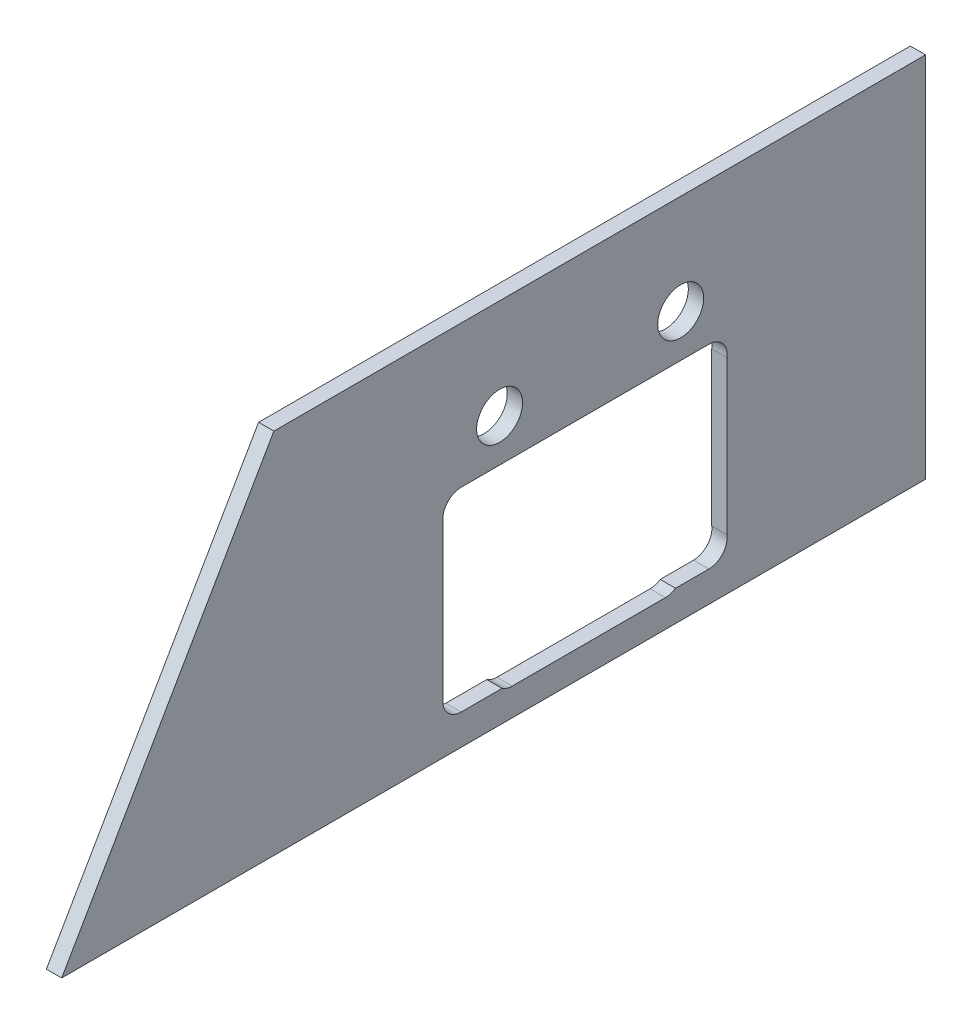
ISO-10303-21;
HEADER;
FILE_DESCRIPTION(('STEP AP214'),'2;1');
FILE_NAME('part.step','',(''),(''),'','','');
FILE_SCHEMA(('AUTOMOTIVE_DESIGN { 1 0 10303 214 1 1 1 1 }'));
ENDSEC;
DATA;
#1=APPLICATION_CONTEXT('core data for automotive mechanical design processes');
#2=APPLICATION_PROTOCOL_DEFINITION('international standard','automotive_design',2000,#1);
#3=PRODUCT_CONTEXT('',#1,'mechanical');
#4=PRODUCT('Part','Part','',(#3));
#5=PRODUCT_RELATED_PRODUCT_CATEGORY('part','',(#4));
#6=PRODUCT_DEFINITION_FORMATION('','',#4);
#7=PRODUCT_DEFINITION_CONTEXT('part definition',#1,'design');
#8=PRODUCT_DEFINITION('design','',#6,#7);
#9=PRODUCT_DEFINITION_SHAPE('','',#8);
#10=(LENGTH_UNIT() NAMED_UNIT(*) SI_UNIT(.MILLI.,.METRE.));
#11=(NAMED_UNIT(*) PLANE_ANGLE_UNIT() SI_UNIT($,.RADIAN.));
#12=(NAMED_UNIT(*) SI_UNIT($,.STERADIAN.) SOLID_ANGLE_UNIT());
#13=UNCERTAINTY_MEASURE_WITH_UNIT(LENGTH_MEASURE(1.E-05),#10,'distance_accuracy_value','');
#14=(GEOMETRIC_REPRESENTATION_CONTEXT(3) GLOBAL_UNCERTAINTY_ASSIGNED_CONTEXT((#13)) GLOBAL_UNIT_ASSIGNED_CONTEXT((#10,
#11,#12)) REPRESENTATION_CONTEXT('',''));
#15=CARTESIAN_POINT('',(0.,0.,0.));
#16=DIRECTION('',(0.,0.,1.));
#17=DIRECTION('',(1.,0.,0.));
#18=AXIS2_PLACEMENT_3D('',#15,#16,#17);
#19=CARTESIAN_POINT('',(1.,-19.5,-28.2163391035964));
#20=DIRECTION('',(0.,1.,0.));
#21=DIRECTION('',(0.,0.,1.));
#22=AXIS2_PLACEMENT_3D('',#19,#20,#21);
#23=PLANE('',#22);
#24=DIRECTION('',(0.,0.,-1.));
#25=VECTOR('',#24,1.);
#26=CARTESIAN_POINT('',(0.,-19.5,-28.2163391035964));
#27=LINE('',#26,#25);
#28=CARTESIAN_POINT('',(0.,-19.5,28.2163391035964));
#29=VERTEX_POINT('',#28);
#30=CARTESIAN_POINT('',(0.,-19.5,-28.2163391035964));
#31=VERTEX_POINT('',#30);
#32=EDGE_CURVE('E261',#29,#31,#27,.T.);
#33=ORIENTED_EDGE('',*,*,#32,.T.);
#34=DIRECTION('',(-1.,0.,0.));
#35=VECTOR('',#34,1.);
#36=CARTESIAN_POINT('',(1.,-19.5,-28.2163391035964));
#37=LINE('',#36,#35);
#38=CARTESIAN_POINT('',(1.,-19.5,-28.2163391035964));
#39=VERTEX_POINT('',#38);
#40=EDGE_CURVE('E50',#39,#31,#37,.T.);
#41=ORIENTED_EDGE('',*,*,#40,.F.);
#42=DIRECTION('',(0.,0.,-1.));
#43=VECTOR('',#42,1.);
#44=CARTESIAN_POINT('',(1.,-19.5,-28.2163391035964));
#45=LINE('',#44,#43);
#46=CARTESIAN_POINT('',(1.,-19.5,28.2163391035964));
#47=VERTEX_POINT('',#46);
#48=EDGE_CURVE('E264',#47,#39,#45,.T.);
#49=ORIENTED_EDGE('',*,*,#48,.F.);
#50=DIRECTION('',(-1.,0.,0.));
#51=VECTOR('',#50,1.);
#52=CARTESIAN_POINT('',(1.,-19.5,28.2163391035964));
#53=LINE('',#52,#51);
#54=EDGE_CURVE('E270',#47,#29,#53,.T.);
#55=ORIENTED_EDGE('',*,*,#54,.T.);
#56=EDGE_LOOP('',(#33,#41,#49,#55));
#57=FACE_BOUND('',#56,.T.);
#58=ADVANCED_FACE('F43',(#57),#23,.F.);
#59=CARTESIAN_POINT('',(1.,4.50718127274804,-28.2163391035964));
#60=DIRECTION('',(0.,0.,1.));
#61=DIRECTION('',(1.,0.,0.));
#62=AXIS2_PLACEMENT_3D('',#59,#60,#61);
#63=PLANE('',#62);
#64=DIRECTION('',(0.,1.,0.));
#65=VECTOR('',#64,1.);
#66=CARTESIAN_POINT('',(0.,4.50718127274804,-28.2163391035964));
#67=LINE('',#66,#65);
#68=CARTESIAN_POINT('',(0.,4.50718127274804,-28.2163391035964));
#69=VERTEX_POINT('',#68);
#70=EDGE_CURVE('E273',#31,#69,#67,.T.);
#71=ORIENTED_EDGE('',*,*,#70,.T.);
#72=DIRECTION('',(-1.,0.,0.));
#73=VECTOR('',#72,1.);
#74=CARTESIAN_POINT('',(1.,4.50718127274804,-28.2163391035964));
#75=LINE('',#74,#73);
#76=CARTESIAN_POINT('',(1.,4.50718127274804,-28.2163391035964));
#77=VERTEX_POINT('',#76);
#78=EDGE_CURVE('E281',#77,#69,#75,.T.);
#79=ORIENTED_EDGE('',*,*,#78,.F.);
#80=DIRECTION('',(0.,1.,0.));
#81=VECTOR('',#80,1.);
#82=CARTESIAN_POINT('',(1.,4.50718127274804,-28.2163391035964));
#83=LINE('',#82,#81);
#84=EDGE_CURVE('E94',#39,#77,#83,.T.);
#85=ORIENTED_EDGE('',*,*,#84,.F.);
#86=ORIENTED_EDGE('',*,*,#40,.T.);
#87=EDGE_LOOP('',(#71,#79,#85,#86));
#88=FACE_BOUND('',#87,.T.);
#89=ADVANCED_FACE('F284',(#88),#63,.F.);
#90=CARTESIAN_POINT('',(1.,4.50718127274804,14.3557865332913));
#91=DIRECTION('',(0.,-1.,0.));
#92=DIRECTION('',(0.,0.,-1.));
#93=AXIS2_PLACEMENT_3D('',#90,#91,#92);
#94=PLANE('',#93);
#95=DIRECTION('',(0.,0.,1.));
#96=VECTOR('',#95,1.);
#97=CARTESIAN_POINT('',(0.,4.50718127274804,14.3557865332913));
#98=LINE('',#97,#96);
#99=CARTESIAN_POINT('',(0.,4.50718127274804,14.3557865332913));
#100=VERTEX_POINT('',#99);
#101=EDGE_CURVE('E275',#69,#100,#98,.T.);
#102=ORIENTED_EDGE('',*,*,#101,.T.);
#103=DIRECTION('',(-1.,0.,0.));
#104=VECTOR('',#103,1.);
#105=CARTESIAN_POINT('',(1.,4.50718127274804,14.3557865332913));
#106=LINE('',#105,#104);
#107=CARTESIAN_POINT('',(1.,4.50718127274804,14.3557865332913));
#108=VERTEX_POINT('',#107);
#109=EDGE_CURVE('E279',#108,#100,#106,.T.);
#110=ORIENTED_EDGE('',*,*,#109,.F.);
#111=DIRECTION('',(0.,0.,1.));
#112=VECTOR('',#111,1.);
#113=CARTESIAN_POINT('',(1.,4.50718127274804,14.3557865332913));
#114=LINE('',#113,#112);
#115=EDGE_CURVE('E267',#77,#108,#114,.T.);
#116=ORIENTED_EDGE('',*,*,#115,.F.);
#117=ORIENTED_EDGE('',*,*,#78,.T.);
#118=EDGE_LOOP('',(#102,#110,#116,#117));
#119=FACE_BOUND('',#118,.T.);
#120=ADVANCED_FACE('F293',(#119),#94,.F.);
#121=CARTESIAN_POINT('',(1.,-19.5,28.2163391035964));
#122=DIRECTION('',(0.,-0.499999999999997,-0.86602540378444));
#123=DIRECTION('',(0.,0.86602540378444,-0.499999999999997));
#124=AXIS2_PLACEMENT_3D('',#121,#122,#123);
#125=PLANE('',#124);
#126=DIRECTION('',(0.,-0.86602540378444,0.499999999999997));
#127=VECTOR('',#126,1.);
#128=CARTESIAN_POINT('',(0.,-19.5,28.2163391035964));
#129=LINE('',#128,#127);
#130=EDGE_CURVE('E86',#100,#29,#129,.T.);
#131=ORIENTED_EDGE('',*,*,#130,.T.);
#132=ORIENTED_EDGE('',*,*,#54,.F.);
#133=DIRECTION('',(0.,-0.86602540378444,0.499999999999997));
#134=VECTOR('',#133,1.);
#135=CARTESIAN_POINT('',(1.,-19.5,28.2163391035964));
#136=LINE('',#135,#134);
#137=EDGE_CURVE('E65',#108,#47,#136,.T.);
#138=ORIENTED_EDGE('',*,*,#137,.F.);
#139=ORIENTED_EDGE('',*,*,#109,.T.);
#140=EDGE_LOOP('',(#131,#132,#138,#139));
#141=FACE_BOUND('',#140,.T.);
#142=ADVANCED_FACE('F295',(#141),#125,.F.);
#143=CARTESIAN_POINT('',(1.,0.,0.));
#144=DIRECTION('',(1.,0.,0.));
#145=DIRECTION('',(0.,0.,-1.));
#146=AXIS2_PLACEMENT_3D('',#143,#144,#145);
#147=PLANE('',#146);
#148=DIRECTION('',(0.,0.,-1.));
#149=VECTOR('',#148,1.);
#150=CARTESIAN_POINT('',(1.,-17.5000000000001,2.12539432331838));
#151=LINE('',#150,#149);
#152=CARTESIAN_POINT('',(1.,-17.5,-11.8796640616671));
#153=VERTEX_POINT('',#152);
#154=CARTESIAN_POINT('',(1.,-17.5,-14.0583018670131));
#155=VERTEX_POINT('',#154);
#156=EDGE_CURVE('E204',#153,#155,#151,.T.);
#157=ORIENTED_EDGE('',*,*,#156,.F.);
#158=CARTESIAN_POINT('',(1.,-16.5,-11.216339103596));
#159=DIRECTION('',(-1.,0.,0.));
#160=DIRECTION('',(0.,0.,1.));
#161=AXIS2_PLACEMENT_3D('',#158,#159,#160);
#162=CIRCLE('',#161,1.2);
#163=CARTESIAN_POINT('',(1.,-17.7,-11.216339103596));
#164=VERTEX_POINT('',#163);
#165=EDGE_CURVE('E243',#153,#164,#162,.T.);
#166=ORIENTED_EDGE('',*,*,#165,.T.);
#167=DIRECTION('',(0.,0.,1.));
#168=VECTOR('',#167,1.);
#169=CARTESIAN_POINT('',(1.,-17.7,-1.21633910359602));
#170=LINE('',#169,#168);
#171=CARTESIAN_POINT('',(1.,-17.7,-1.21633910359602));
#172=VERTEX_POINT('',#171);
#173=EDGE_CURVE('E245',#164,#172,#170,.T.);
#174=ORIENTED_EDGE('',*,*,#173,.T.);
#175=CARTESIAN_POINT('',(1.,-16.5,-1.21633910359602));
#176=DIRECTION('',(-1.,0.,0.));
#177=DIRECTION('',(0.,0.,1.));
#178=AXIS2_PLACEMENT_3D('',#175,#176,#177);
#179=CIRCLE('',#178,1.2);
#180=CARTESIAN_POINT('',(1.,-17.5000000000001,-0.553014145525082));
#181=VERTEX_POINT('',#180);
#182=EDGE_CURVE('E249',#172,#181,#179,.T.);
#183=ORIENTED_EDGE('',*,*,#182,.T.);
#184=CARTESIAN_POINT('',(1.,-17.5000000000001,2.12539432331838));
#185=VERTEX_POINT('',#184);
#186=EDGE_CURVE('E205',#185,#181,#151,.T.);
#187=ORIENTED_EDGE('',*,*,#186,.F.);
#188=CARTESIAN_POINT('',(1.,-16.3000195145083,2.11855075413858));
#189=DIRECTION('',(1.,0.,0.));
#190=DIRECTION('',(0.,0.,-1.));
#191=AXIS2_PLACEMENT_3D('',#188,#189,#190);
#192=CIRCLE('',#191,1.20000000000012);
#193=CARTESIAN_POINT('',(1.,-16.1542229816529,3.30966089640405));
#194=VERTEX_POINT('',#193);
#195=EDGE_CURVE('E201',#194,#185,#192,.T.);
#196=ORIENTED_EDGE('',*,*,#195,.F.);
#197=DIRECTION('',(0.,-1.,0.));
#198=VECTOR('',#197,1.);
#199=CARTESIAN_POINT('',(1.,-6.12891273012506,3.30966089640403));
#200=LINE('',#199,#198);
#201=CARTESIAN_POINT('',(1.,-6.12891273012505,3.30966089640402));
#202=VERTEX_POINT('',#201);
#203=EDGE_CURVE('E195',#202,#194,#200,.T.);
#204=ORIENTED_EDGE('',*,*,#203,.F.);
#205=CARTESIAN_POINT('',(1.,-5.9859804854917,2.1182036485583));
#206=DIRECTION('',(1.,0.,0.));
#207=DIRECTION('',(0.,0.,-1.));
#208=AXIS2_PLACEMENT_3D('',#205,#206,#207);
#209=CIRCLE('',#208,1.20000000000001);
#210=CARTESIAN_POINT('',(1.,-4.78599999999996,2.12504721772877));
#211=VERTEX_POINT('',#210);
#212=EDGE_CURVE('E193',#211,#202,#209,.T.);
#213=ORIENTED_EDGE('',*,*,#212,.F.);
#214=DIRECTION('',(0.,0.,1.));
#215=VECTOR('',#214,1.);
#216=CARTESIAN_POINT('',(1.,-4.78599999999996,-14.0586489726027));
#217=LINE('',#216,#215);
#218=CARTESIAN_POINT('',(1.,-4.78599999999996,-14.0586489726027));
#219=VERTEX_POINT('',#218);
#220=EDGE_CURVE('E170',#219,#211,#217,.T.);
#221=ORIENTED_EDGE('',*,*,#220,.F.);
#222=CARTESIAN_POINT('',(1.,-5.98599512140252,-14.0552271879666));
#223=DIRECTION('',(1.,0.,0.));
#224=DIRECTION('',(0.,0.,-1.));
#225=AXIS2_PLACEMENT_3D('',#222,#223,#224);
#226=CIRCLE('',#225,1.19999999999996);
#227=CARTESIAN_POINT('',(1.,-6.13177716572033,-15.246339103596));
#228=VERTEX_POINT('',#227);
#229=EDGE_CURVE('E180',#228,#219,#226,.T.);
#230=ORIENTED_EDGE('',*,*,#229,.F.);
#231=DIRECTION('',(0.,1.,0.));
#232=VECTOR('',#231,1.);
#233=CARTESIAN_POINT('',(1.,-16.157087417248,-15.246339103596));
#234=LINE('',#233,#232);
#235=CARTESIAN_POINT('',(1.,-16.157087417248,-15.246339103596));
#236=VERTEX_POINT('',#235);
#237=EDGE_CURVE('E177',#236,#228,#234,.T.);
#238=ORIENTED_EDGE('',*,*,#237,.F.);
#239=CARTESIAN_POINT('',(1.,-16.3000048785974,-14.0548800823781));
#240=DIRECTION('',(1.,0.,0.));
#241=DIRECTION('',(0.,0.,-1.));
#242=AXIS2_PLACEMENT_3D('',#239,#240,#241);
#243=CIRCLE('',#242,1.20000000000001);
#244=EDGE_CURVE('E207',#155,#236,#243,.T.);
#245=ORIENTED_EDGE('',*,*,#244,.F.);
#246=EDGE_LOOP('',(#157,#166,#174,#183,#187,#196,#204,#213,#221,#230,#238,#245));
#247=FACE_BOUND('',#246,.T.);
#248=CARTESIAN_POINT('',(1.,-2.,-12.216339103596));
#249=DIRECTION('',(-1.,0.,0.));
#250=DIRECTION('',(0.,0.,1.));
#251=AXIS2_PLACEMENT_3D('',#248,#249,#250);
#252=CIRCLE('',#251,1.5);
#253=CARTESIAN_POINT('',(1.,-2.,-10.716339103596));
#254=VERTEX_POINT('',#253);
#255=EDGE_CURVE('E231',#254,#254,#252,.T.);
#256=ORIENTED_EDGE('',*,*,#255,.T.);
#257=EDGE_LOOP('',(#256));
#258=FACE_BOUND('',#257,.T.);
#259=CARTESIAN_POINT('',(1.,-2.,-0.387535442337716));
#260=DIRECTION('',(-1.,0.,0.));
#261=DIRECTION('',(0.,0.,1.));
#262=AXIS2_PLACEMENT_3D('',#259,#260,#261);
#263=CIRCLE('',#262,1.5);
#264=CARTESIAN_POINT('',(1.,-2.,1.11246455766228));
#265=VERTEX_POINT('',#264);
#266=EDGE_CURVE('E238',#265,#265,#263,.T.);
#267=ORIENTED_EDGE('',*,*,#266,.T.);
#268=EDGE_LOOP('',(#267));
#269=FACE_BOUND('',#268,.T.);
#270=ORIENTED_EDGE('',*,*,#48,.T.);
#271=ORIENTED_EDGE('',*,*,#84,.T.);
#272=ORIENTED_EDGE('',*,*,#115,.T.);
#273=ORIENTED_EDGE('',*,*,#137,.T.);
#274=EDGE_LOOP('',(#270,#271,#272,#273));
#275=FACE_BOUND('',#274,.T.);
#276=ADVANCED_FACE('F189',(#247,#258,#269,#275),#147,.T.);
#277=CARTESIAN_POINT('',(0.,0.,0.));
#278=DIRECTION('',(1.,0.,0.));
#279=DIRECTION('',(0.,0.,-1.));
#280=AXIS2_PLACEMENT_3D('',#277,#278,#279);
#281=PLANE('',#280);
#282=CARTESIAN_POINT('',(0.,-16.5,-11.216339103596));
#283=DIRECTION('',(-1.,0.,0.));
#284=DIRECTION('',(0.,0.,1.));
#285=AXIS2_PLACEMENT_3D('',#282,#283,#284);
#286=CIRCLE('',#285,1.2);
#287=CARTESIAN_POINT('',(0.,-17.5,-11.8796640616671));
#288=VERTEX_POINT('',#287);
#289=CARTESIAN_POINT('',(0.,-17.7,-11.216339103596));
#290=VERTEX_POINT('',#289);
#291=EDGE_CURVE('E234',#288,#290,#286,.T.);
#292=ORIENTED_EDGE('',*,*,#291,.F.);
#293=DIRECTION('',(0.,0.,1.));
#294=VECTOR('',#293,1.);
#295=CARTESIAN_POINT('',(0.,-17.5000000000001,2.12539432331838));
#296=LINE('',#295,#294);
#297=CARTESIAN_POINT('',(0.,-17.5,-14.0583018670131));
#298=VERTEX_POINT('',#297);
#299=EDGE_CURVE('E57',#298,#288,#296,.T.);
#300=ORIENTED_EDGE('',*,*,#299,.F.);
#301=CARTESIAN_POINT('',(0.,-16.3000048785974,-14.0548800823781));
#302=DIRECTION('',(1.,0.,0.));
#303=DIRECTION('',(0.,0.,-1.));
#304=AXIS2_PLACEMENT_3D('',#301,#302,#303);
#305=CIRCLE('',#304,1.20000000000001);
#306=CARTESIAN_POINT('',(0.,-16.157087417248,-15.246339103596));
#307=VERTEX_POINT('',#306);
#308=EDGE_CURVE('E481',#307,#298,#305,.F.);
#309=ORIENTED_EDGE('',*,*,#308,.F.);
#310=DIRECTION('',(0.,-1.,0.));
#311=VECTOR('',#310,1.);
#312=CARTESIAN_POINT('',(0.,-16.157087417248,-15.246339103596));
#313=LINE('',#312,#311);
#314=CARTESIAN_POINT('',(0.,-6.13177716572033,-15.246339103596));
#315=VERTEX_POINT('',#314);
#316=EDGE_CURVE('E480',#315,#307,#313,.T.);
#317=ORIENTED_EDGE('',*,*,#316,.F.);
#318=CARTESIAN_POINT('',(0.,-5.98599512140252,-14.0552271879666));
#319=DIRECTION('',(1.,0.,0.));
#320=DIRECTION('',(0.,0.,-1.));
#321=AXIS2_PLACEMENT_3D('',#318,#319,#320);
#322=CIRCLE('',#321,1.19999999999996);
#323=CARTESIAN_POINT('',(0.,-4.78599999999996,-14.0586489726027));
#324=VERTEX_POINT('',#323);
#325=EDGE_CURVE('E227',#324,#315,#322,.F.);
#326=ORIENTED_EDGE('',*,*,#325,.F.);
#327=DIRECTION('',(0.,0.,-1.));
#328=VECTOR('',#327,1.);
#329=CARTESIAN_POINT('',(0.,-4.78599999999996,-14.0586489726027));
#330=LINE('',#329,#328);
#331=CARTESIAN_POINT('',(0.,-4.78599999999996,2.12504721772877));
#332=VERTEX_POINT('',#331);
#333=EDGE_CURVE('E173',#332,#324,#330,.T.);
#334=ORIENTED_EDGE('',*,*,#333,.F.);
#335=CARTESIAN_POINT('',(0.,-5.9859804854917,2.1182036485583));
#336=DIRECTION('',(1.,0.,0.));
#337=DIRECTION('',(0.,0.,-1.));
#338=AXIS2_PLACEMENT_3D('',#335,#336,#337);
#339=CIRCLE('',#338,1.20000000000001);
#340=CARTESIAN_POINT('',(0.,-6.12891273012505,3.30966089640402));
#341=VERTEX_POINT('',#340);
#342=EDGE_CURVE('E212',#341,#332,#339,.F.);
#343=ORIENTED_EDGE('',*,*,#342,.F.);
#344=DIRECTION('',(0.,1.,0.));
#345=VECTOR('',#344,1.);
#346=CARTESIAN_POINT('',(0.,-6.12891273012506,3.30966089640403));
#347=LINE('',#346,#345);
#348=CARTESIAN_POINT('',(0.,-16.1542229816529,3.30966089640405));
#349=VERTEX_POINT('',#348);
#350=EDGE_CURVE('E475',#349,#341,#347,.T.);
#351=ORIENTED_EDGE('',*,*,#350,.F.);
#352=CARTESIAN_POINT('',(0.,-16.3000195145083,2.11855075413858));
#353=DIRECTION('',(1.,0.,0.));
#354=DIRECTION('',(0.,0.,-1.));
#355=AXIS2_PLACEMENT_3D('',#352,#353,#354);
#356=CIRCLE('',#355,1.20000000000012);
#357=CARTESIAN_POINT('',(0.,-17.5000000000001,2.12539432331838));
#358=VERTEX_POINT('',#357);
#359=EDGE_CURVE('E487',#358,#349,#356,.F.);
#360=ORIENTED_EDGE('',*,*,#359,.F.);
#361=CARTESIAN_POINT('',(0.,-17.5000000000001,-0.553014145525082));
#362=VERTEX_POINT('',#361);
#363=EDGE_CURVE('E486',#362,#358,#296,.T.);
#364=ORIENTED_EDGE('',*,*,#363,.F.);
#365=CARTESIAN_POINT('',(0.,-16.5,-1.21633910359602));
#366=DIRECTION('',(-1.,0.,0.));
#367=DIRECTION('',(0.,0.,1.));
#368=AXIS2_PLACEMENT_3D('',#365,#366,#367);
#369=CIRCLE('',#368,1.2);
#370=CARTESIAN_POINT('',(0.,-17.7,-1.21633910359602));
#371=VERTEX_POINT('',#370);
#372=EDGE_CURVE('E246',#371,#362,#369,.T.);
#373=ORIENTED_EDGE('',*,*,#372,.F.);
#374=DIRECTION('',(0.,0.,1.));
#375=VECTOR('',#374,1.);
#376=CARTESIAN_POINT('',(0.,-17.7,-1.21633910359602));
#377=LINE('',#376,#375);
#378=EDGE_CURVE('E254',#290,#371,#377,.T.);
#379=ORIENTED_EDGE('',*,*,#378,.F.);
#380=EDGE_LOOP('',(#292,#300,#309,#317,#326,#334,#343,#351,#360,#364,#373,#379));
#381=FACE_BOUND('',#380,.T.);
#382=CARTESIAN_POINT('',(0.,-2.,-12.216339103596));
#383=DIRECTION('',(-1.,0.,0.));
#384=DIRECTION('',(0.,0.,1.));
#385=AXIS2_PLACEMENT_3D('',#382,#383,#384);
#386=CIRCLE('',#385,1.5);
#387=CARTESIAN_POINT('',(0.,-2.,-10.716339103596));
#388=VERTEX_POINT('',#387);
#389=EDGE_CURVE('E235',#388,#388,#386,.T.);
#390=ORIENTED_EDGE('',*,*,#389,.F.);
#391=EDGE_LOOP('',(#390));
#392=FACE_BOUND('',#391,.T.);
#393=CARTESIAN_POINT('',(0.,-2.,-0.387535442337716));
#394=DIRECTION('',(-1.,0.,0.));
#395=DIRECTION('',(0.,0.,1.));
#396=AXIS2_PLACEMENT_3D('',#393,#394,#395);
#397=CIRCLE('',#396,1.5);
#398=CARTESIAN_POINT('',(0.,-2.,1.11246455766228));
#399=VERTEX_POINT('',#398);
#400=EDGE_CURVE('E230',#399,#399,#397,.T.);
#401=ORIENTED_EDGE('',*,*,#400,.F.);
#402=EDGE_LOOP('',(#401));
#403=FACE_BOUND('',#402,.T.);
#404=ORIENTED_EDGE('',*,*,#32,.F.);
#405=ORIENTED_EDGE('',*,*,#130,.F.);
#406=ORIENTED_EDGE('',*,*,#101,.F.);
#407=ORIENTED_EDGE('',*,*,#70,.F.);
#408=EDGE_LOOP('',(#404,#405,#406,#407));
#409=FACE_BOUND('',#408,.T.);
#410=ADVANCED_FACE('F289',(#381,#392,#403,#409),#281,.F.);
#411=CARTESIAN_POINT('',(1.,-16.5,-1.21633910359602));
#412=DIRECTION('',(-1.,0.,0.));
#413=DIRECTION('',(0.,0.,1.));
#414=AXIS2_PLACEMENT_3D('',#411,#412,#413);
#415=CYLINDRICAL_SURFACE('',#414,1.2);
#416=ORIENTED_EDGE('',*,*,#372,.T.);
#417=DIRECTION('',(-1.,0.,0.));
#418=VECTOR('',#417,1.);
#419=CARTESIAN_POINT('',(1.,-17.5000000000001,-0.553014145525082));
#420=LINE('',#419,#418);
#421=EDGE_CURVE('E226',#362,#181,#420,.F.);
#422=ORIENTED_EDGE('',*,*,#421,.T.);
#423=ORIENTED_EDGE('',*,*,#182,.F.);
#424=DIRECTION('',(-1.,0.,0.));
#425=VECTOR('',#424,1.);
#426=CARTESIAN_POINT('',(1.,-17.7,-1.21633910359602));
#427=LINE('',#426,#425);
#428=EDGE_CURVE('E259',#172,#371,#427,.T.);
#429=ORIENTED_EDGE('',*,*,#428,.T.);
#430=EDGE_LOOP('',(#416,#422,#423,#429));
#431=FACE_BOUND('',#430,.T.);
#432=ADVANCED_FACE('F302',(#431),#415,.F.);
#433=CARTESIAN_POINT('',(1.,-17.7,-1.21633910359602));
#434=DIRECTION('',(0.,-1.,0.));
#435=DIRECTION('',(0.,0.,-1.));
#436=AXIS2_PLACEMENT_3D('',#433,#434,#435);
#437=PLANE('',#436);
#438=ORIENTED_EDGE('',*,*,#378,.T.);
#439=ORIENTED_EDGE('',*,*,#428,.F.);
#440=ORIENTED_EDGE('',*,*,#173,.F.);
#441=DIRECTION('',(-1.,0.,0.));
#442=VECTOR('',#441,1.);
#443=CARTESIAN_POINT('',(1.,-17.7,-11.216339103596));
#444=LINE('',#443,#442);
#445=EDGE_CURVE('E252',#164,#290,#444,.T.);
#446=ORIENTED_EDGE('',*,*,#445,.T.);
#447=EDGE_LOOP('',(#438,#439,#440,#446));
#448=FACE_BOUND('',#447,.T.);
#449=ADVANCED_FACE('F340',(#448),#437,.F.);
#450=CARTESIAN_POINT('',(1.,-16.5,-11.216339103596));
#451=DIRECTION('',(-1.,0.,0.));
#452=DIRECTION('',(0.,0.,1.));
#453=AXIS2_PLACEMENT_3D('',#450,#451,#452);
#454=CYLINDRICAL_SURFACE('',#453,1.2);
#455=ORIENTED_EDGE('',*,*,#165,.F.);
#456=DIRECTION('',(-1.,0.,0.));
#457=VECTOR('',#456,1.);
#458=CARTESIAN_POINT('',(1.,-17.5,-11.8796640616671));
#459=LINE('',#458,#457);
#460=EDGE_CURVE('E11',#153,#288,#459,.T.);
#461=ORIENTED_EDGE('',*,*,#460,.T.);
#462=ORIENTED_EDGE('',*,*,#291,.T.);
#463=ORIENTED_EDGE('',*,*,#445,.F.);
#464=EDGE_LOOP('',(#455,#461,#462,#463));
#465=FACE_BOUND('',#464,.T.);
#466=ADVANCED_FACE('F350',(#465),#454,.F.);
#467=CARTESIAN_POINT('',(1.,-2.,-0.387535442337716));
#468=DIRECTION('',(-1.,0.,0.));
#469=DIRECTION('',(0.,0.,1.));
#470=AXIS2_PLACEMENT_3D('',#467,#468,#469);
#471=CYLINDRICAL_SURFACE('',#470,1.5);
#472=ORIENTED_EDGE('',*,*,#266,.F.);
#473=EDGE_LOOP('',(#472));
#474=FACE_BOUND('',#473,.T.);
#475=ORIENTED_EDGE('',*,*,#400,.T.);
#476=EDGE_LOOP('',(#475));
#477=FACE_BOUND('',#476,.T.);
#478=ADVANCED_FACE('F357',(#474,#477),#471,.F.);
#479=CARTESIAN_POINT('',(1.,-2.,-12.216339103596));
#480=DIRECTION('',(-1.,0.,0.));
#481=DIRECTION('',(0.,0.,1.));
#482=AXIS2_PLACEMENT_3D('',#479,#480,#481);
#483=CYLINDRICAL_SURFACE('',#482,1.5);
#484=ORIENTED_EDGE('',*,*,#255,.F.);
#485=EDGE_LOOP('',(#484));
#486=FACE_BOUND('',#485,.T.);
#487=ORIENTED_EDGE('',*,*,#389,.T.);
#488=EDGE_LOOP('',(#487));
#489=FACE_BOUND('',#488,.T.);
#490=ADVANCED_FACE('F369',(#486,#489),#483,.F.);
#491=CARTESIAN_POINT('',(-22.5084655861443,-17.5000000000001,2.12539432331838));
#492=DIRECTION('',(0.,-1.,0.));
#493=DIRECTION('',(0.,0.,-1.));
#494=AXIS2_PLACEMENT_3D('',#491,#492,#493);
#495=PLANE('',#494);
#496=ORIENTED_EDGE('',*,*,#363,.T.);
#497=DIRECTION('',(1.,0.,0.));
#498=VECTOR('',#497,1.);
#499=CARTESIAN_POINT('',(-22.5084655861443,-17.5000000000001,2.12539432331838));
#500=LINE('',#499,#498);
#501=EDGE_CURVE('E218',#358,#185,#500,.T.);
#502=ORIENTED_EDGE('',*,*,#501,.T.);
#503=ORIENTED_EDGE('',*,*,#186,.T.);
#504=ORIENTED_EDGE('',*,*,#421,.F.);
#505=EDGE_LOOP('',(#496,#502,#503,#504));
#506=FACE_BOUND('',#505,.T.);
#507=ADVANCED_FACE('F364',(#506),#495,.F.);
#508=ORIENTED_EDGE('',*,*,#156,.T.);
#509=DIRECTION('',(1.,0.,0.));
#510=VECTOR('',#509,1.);
#511=CARTESIAN_POINT('',(-22.5084655861443,-17.5,-14.0583018670131));
#512=LINE('',#511,#510);
#513=EDGE_CURVE('E215',#298,#155,#512,.T.);
#514=ORIENTED_EDGE('',*,*,#513,.F.);
#515=ORIENTED_EDGE('',*,*,#299,.T.);
#516=ORIENTED_EDGE('',*,*,#460,.F.);
#517=EDGE_LOOP('',(#508,#514,#515,#516));
#518=FACE_BOUND('',#517,.T.);
#519=ADVANCED_FACE('F368',(#518),#495,.F.);
#520=CARTESIAN_POINT('',(-22.5084655861443,-5.98599512140252,-14.0552271879666));
#521=DIRECTION('',(1.,0.,0.));
#522=DIRECTION('',(0.,0.,-1.));
#523=AXIS2_PLACEMENT_3D('',#520,#521,#522);
#524=CYLINDRICAL_SURFACE('',#523,1.19999999999996);
#525=ORIENTED_EDGE('',*,*,#325,.T.);
#526=DIRECTION('',(1.,0.,0.));
#527=VECTOR('',#526,1.);
#528=CARTESIAN_POINT('',(-22.5084655861443,-6.13177716572033,-15.246339103596));
#529=LINE('',#528,#527);
#530=EDGE_CURVE('E183',#315,#228,#529,.T.);
#531=ORIENTED_EDGE('',*,*,#530,.T.);
#532=ORIENTED_EDGE('',*,*,#229,.T.);
#533=DIRECTION('',(1.,0.,0.));
#534=VECTOR('',#533,1.);
#535=CARTESIAN_POINT('',(-22.5084655861443,-4.78599999999996,-14.0586489726027));
#536=LINE('',#535,#534);
#537=EDGE_CURVE('E165',#324,#219,#536,.T.);
#538=ORIENTED_EDGE('',*,*,#537,.F.);
#539=EDGE_LOOP('',(#525,#531,#532,#538));
#540=FACE_BOUND('',#539,.T.);
#541=ADVANCED_FACE('F181',(#540),#524,.F.);
#542=CARTESIAN_POINT('',(-22.5084655861443,-16.157087417248,-15.246339103596));
#543=DIRECTION('',(0.,0.,-1.));
#544=DIRECTION('',(0.,1.,0.));
#545=AXIS2_PLACEMENT_3D('',#542,#543,#544);
#546=PLANE('',#545);
#547=ORIENTED_EDGE('',*,*,#316,.T.);
#548=DIRECTION('',(1.,0.,0.));
#549=VECTOR('',#548,1.);
#550=CARTESIAN_POINT('',(-22.5084655861443,-16.157087417248,-15.246339103596));
#551=LINE('',#550,#549);
#552=EDGE_CURVE('E213',#307,#236,#551,.T.);
#553=ORIENTED_EDGE('',*,*,#552,.T.);
#554=ORIENTED_EDGE('',*,*,#237,.T.);
#555=ORIENTED_EDGE('',*,*,#530,.F.);
#556=EDGE_LOOP('',(#547,#553,#554,#555));
#557=FACE_BOUND('',#556,.T.);
#558=ADVANCED_FACE('F385',(#557),#546,.F.);
#559=CARTESIAN_POINT('',(-22.5084655861443,-16.3000048785974,-14.0548800823781));
#560=DIRECTION('',(1.,0.,0.));
#561=DIRECTION('',(0.,0.,-1.));
#562=AXIS2_PLACEMENT_3D('',#559,#560,#561);
#563=CYLINDRICAL_SURFACE('',#562,1.20000000000001);
#564=ORIENTED_EDGE('',*,*,#308,.T.);
#565=ORIENTED_EDGE('',*,*,#513,.T.);
#566=ORIENTED_EDGE('',*,*,#244,.T.);
#567=ORIENTED_EDGE('',*,*,#552,.F.);
#568=EDGE_LOOP('',(#564,#565,#566,#567));
#569=FACE_BOUND('',#568,.T.);
#570=ADVANCED_FACE('F393',(#569),#563,.F.);
#571=CARTESIAN_POINT('',(-22.5084655861443,-16.3000195145083,2.11855075413858));
#572=DIRECTION('',(1.,0.,0.));
#573=DIRECTION('',(0.,0.,-1.));
#574=AXIS2_PLACEMENT_3D('',#571,#572,#573);
#575=CYLINDRICAL_SURFACE('',#574,1.20000000000012);
#576=ORIENTED_EDGE('',*,*,#359,.T.);
#577=DIRECTION('',(1.,0.,0.));
#578=VECTOR('',#577,1.);
#579=CARTESIAN_POINT('',(-22.5084655861443,-16.1542229816529,3.30966089640405));
#580=LINE('',#579,#578);
#581=EDGE_CURVE('E220',#349,#194,#580,.T.);
#582=ORIENTED_EDGE('',*,*,#581,.T.);
#583=ORIENTED_EDGE('',*,*,#195,.T.);
#584=ORIENTED_EDGE('',*,*,#501,.F.);
#585=EDGE_LOOP('',(#576,#582,#583,#584));
#586=FACE_BOUND('',#585,.T.);
#587=ADVANCED_FACE('F402',(#586),#575,.F.);
#588=CARTESIAN_POINT('',(-22.5084655861443,-6.12891273012506,3.30966089640403));
#589=DIRECTION('',(0.,0.,1.));
#590=DIRECTION('',(0.,-1.,0.));
#591=AXIS2_PLACEMENT_3D('',#588,#589,#590);
#592=PLANE('',#591);
#593=ORIENTED_EDGE('',*,*,#350,.T.);
#594=DIRECTION('',(1.,0.,0.));
#595=VECTOR('',#594,1.);
#596=CARTESIAN_POINT('',(-22.5084655861443,-6.12891273012505,3.30966089640402));
#597=LINE('',#596,#595);
#598=EDGE_CURVE('E222',#341,#202,#597,.T.);
#599=ORIENTED_EDGE('',*,*,#598,.T.);
#600=ORIENTED_EDGE('',*,*,#203,.T.);
#601=ORIENTED_EDGE('',*,*,#581,.F.);
#602=EDGE_LOOP('',(#593,#599,#600,#601));
#603=FACE_BOUND('',#602,.T.);
#604=ADVANCED_FACE('F411',(#603),#592,.F.);
#605=CARTESIAN_POINT('',(-22.5084655861443,-5.9859804854917,2.1182036485583));
#606=DIRECTION('',(1.,0.,0.));
#607=DIRECTION('',(0.,0.,-1.));
#608=AXIS2_PLACEMENT_3D('',#605,#606,#607);
#609=CYLINDRICAL_SURFACE('',#608,1.20000000000001);
#610=ORIENTED_EDGE('',*,*,#342,.T.);
#611=DIRECTION('',(1.,0.,0.));
#612=VECTOR('',#611,1.);
#613=CARTESIAN_POINT('',(-22.5084655861443,-4.78599999999996,2.12504721772877));
#614=LINE('',#613,#612);
#615=EDGE_CURVE('E176',#332,#211,#614,.T.);
#616=ORIENTED_EDGE('',*,*,#615,.T.);
#617=ORIENTED_EDGE('',*,*,#212,.T.);
#618=ORIENTED_EDGE('',*,*,#598,.F.);
#619=EDGE_LOOP('',(#610,#616,#617,#618));
#620=FACE_BOUND('',#619,.T.);
#621=ADVANCED_FACE('F420',(#620),#609,.F.);
#622=CARTESIAN_POINT('',(-22.5084655861443,-4.78599999999996,-14.0586489726027));
#623=DIRECTION('',(0.,1.,0.));
#624=DIRECTION('',(0.,0.,1.));
#625=AXIS2_PLACEMENT_3D('',#622,#623,#624);
#626=PLANE('',#625);
#627=ORIENTED_EDGE('',*,*,#333,.T.);
#628=ORIENTED_EDGE('',*,*,#537,.T.);
#629=ORIENTED_EDGE('',*,*,#220,.T.);
#630=ORIENTED_EDGE('',*,*,#615,.F.);
#631=EDGE_LOOP('',(#627,#628,#629,#630));
#632=FACE_BOUND('',#631,.T.);
#633=ADVANCED_FACE('F167',(#632),#626,.F.);
#634=CLOSED_SHELL('',(#58,#89,#120,#142,#276,#410,#432,#449,#466,#478,#490,#507,#519,#541,#558,
#570,#587,#604,#621,#633));
#635=MANIFOLD_SOLID_BREP('B2',#634);
#636=ADVANCED_BREP_SHAPE_REPRESENTATION('',(#18,#635),#14);
#637=SHAPE_DEFINITION_REPRESENTATION(#9,#636);
ENDSEC;
END-ISO-10303-21;
